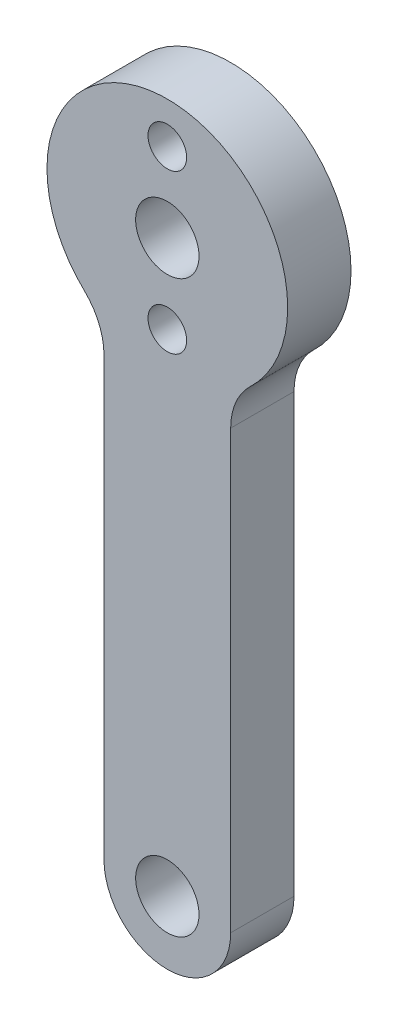
ISO-10303-21;
HEADER;
FILE_DESCRIPTION(('STEP AP214'),'2;1');
FILE_NAME('part.step','',(''),(''),'','','');
FILE_SCHEMA(('AUTOMOTIVE_DESIGN { 1 0 10303 214 1 1 1 1 }'));
ENDSEC;
DATA;
#1=APPLICATION_CONTEXT('core data for automotive mechanical design processes');
#2=APPLICATION_PROTOCOL_DEFINITION('international standard','automotive_design',2000,#1);
#3=PRODUCT_CONTEXT('',#1,'mechanical');
#4=PRODUCT('Part','Part','',(#3));
#5=PRODUCT_RELATED_PRODUCT_CATEGORY('part','',(#4));
#6=PRODUCT_DEFINITION_FORMATION('','',#4);
#7=PRODUCT_DEFINITION_CONTEXT('part definition',#1,'design');
#8=PRODUCT_DEFINITION('design','',#6,#7);
#9=PRODUCT_DEFINITION_SHAPE('','',#8);
#10=(LENGTH_UNIT() NAMED_UNIT(*) SI_UNIT(.MILLI.,.METRE.));
#11=(NAMED_UNIT(*) PLANE_ANGLE_UNIT() SI_UNIT($,.RADIAN.));
#12=(NAMED_UNIT(*) SI_UNIT($,.STERADIAN.) SOLID_ANGLE_UNIT());
#13=UNCERTAINTY_MEASURE_WITH_UNIT(LENGTH_MEASURE(1.E-05),#10,'distance_accuracy_value','');
#14=(GEOMETRIC_REPRESENTATION_CONTEXT(3) GLOBAL_UNCERTAINTY_ASSIGNED_CONTEXT((#13)) GLOBAL_UNIT_ASSIGNED_CONTEXT((#10,
#11,#12)) REPRESENTATION_CONTEXT('',''));
#15=CARTESIAN_POINT('',(0.,0.,0.));
#16=DIRECTION('',(0.,0.,1.));
#17=DIRECTION('',(1.,0.,0.));
#18=AXIS2_PLACEMENT_3D('',#15,#16,#17);
#19=CARTESIAN_POINT('',(0.,-45.,5.));
#20=DIRECTION('',(0.,0.,-1.));
#21=DIRECTION('',(-1.,0.,0.));
#22=AXIS2_PLACEMENT_3D('',#19,#20,#21);
#23=CYLINDRICAL_SURFACE('',#22,5.);
#24=CARTESIAN_POINT('',(0.,-45.,0.));
#25=DIRECTION('',(0.,0.,1.));
#26=DIRECTION('',(1.,0.,0.));
#27=AXIS2_PLACEMENT_3D('',#24,#25,#26);
#28=CIRCLE('',#27,5.);
#29=CARTESIAN_POINT('',(-4.99999999999999,-45.,0.));
#30=VERTEX_POINT('',#29);
#31=CARTESIAN_POINT('',(5.00000000000001,-45.,0.));
#32=VERTEX_POINT('',#31);
#33=EDGE_CURVE('E115',#30,#32,#28,.T.);
#34=ORIENTED_EDGE('',*,*,#33,.T.);
#35=DIRECTION('',(0.,0.,-1.));
#36=VECTOR('',#35,1.);
#37=CARTESIAN_POINT('',(5.00000000000001,-45.,5.));
#38=LINE('',#37,#36);
#39=CARTESIAN_POINT('',(5.00000000000001,-45.,5.));
#40=VERTEX_POINT('',#39);
#41=EDGE_CURVE('E96',#40,#32,#38,.T.);
#42=ORIENTED_EDGE('',*,*,#41,.F.);
#43=CARTESIAN_POINT('',(0.,-45.,5.));
#44=DIRECTION('',(0.,0.,1.));
#45=DIRECTION('',(1.,0.,0.));
#46=AXIS2_PLACEMENT_3D('',#43,#44,#45);
#47=CIRCLE('',#46,5.);
#48=CARTESIAN_POINT('',(-4.99999999999999,-45.,5.));
#49=VERTEX_POINT('',#48);
#50=EDGE_CURVE('E103',#49,#40,#47,.T.);
#51=ORIENTED_EDGE('',*,*,#50,.F.);
#52=DIRECTION('',(0.,0.,-1.));
#53=VECTOR('',#52,1.);
#54=CARTESIAN_POINT('',(-4.99999999999999,-45.,5.));
#55=LINE('',#54,#53);
#56=EDGE_CURVE('E118',#49,#30,#55,.T.);
#57=ORIENTED_EDGE('',*,*,#56,.T.);
#58=EDGE_LOOP('',(#34,#42,#51,#57));
#59=FACE_BOUND('',#58,.T.);
#60=ADVANCED_FACE('F38',(#59),#23,.T.);
#61=CARTESIAN_POINT('',(5.,-8.07774721070176,5.));
#62=DIRECTION('',(-1.,0.,0.));
#63=DIRECTION('',(0.,-1.,0.));
#64=AXIS2_PLACEMENT_3D('',#61,#62,#63);
#65=PLANE('',#64);
#66=DIRECTION('',(0.,1.,0.));
#67=VECTOR('',#66,1.);
#68=CARTESIAN_POINT('',(5.,-8.07774721070176,0.));
#69=LINE('',#68,#67);
#70=CARTESIAN_POINT('',(5.,-10.5,0.));
#71=VERTEX_POINT('',#70);
#72=EDGE_CURVE('E157',#32,#71,#69,.T.);
#73=ORIENTED_EDGE('',*,*,#72,.T.);
#74=DIRECTION('',(0.,0.,1.));
#75=VECTOR('',#74,1.);
#76=CARTESIAN_POINT('',(5.,-10.5,5.));
#77=LINE('',#76,#75);
#78=CARTESIAN_POINT('',(5.,-10.5,5.));
#79=VERTEX_POINT('',#78);
#80=EDGE_CURVE('E99',#71,#79,#77,.T.);
#81=ORIENTED_EDGE('',*,*,#80,.T.);
#82=DIRECTION('',(0.,1.,0.));
#83=VECTOR('',#82,1.);
#84=CARTESIAN_POINT('',(5.,-8.07774721070176,5.));
#85=LINE('',#84,#83);
#86=EDGE_CURVE('E91',#40,#79,#85,.T.);
#87=ORIENTED_EDGE('',*,*,#86,.F.);
#88=ORIENTED_EDGE('',*,*,#41,.T.);
#89=EDGE_LOOP('',(#73,#81,#87,#88));
#90=FACE_BOUND('',#89,.T.);
#91=ADVANCED_FACE('F94',(#90),#65,.F.);
#92=CARTESIAN_POINT('',(0.,0.,5.));
#93=DIRECTION('',(0.,0.,-1.));
#94=DIRECTION('',(-1.,0.,0.));
#95=AXIS2_PLACEMENT_3D('',#92,#93,#94);
#96=CYLINDRICAL_SURFACE('',#95,9.5);
#97=CARTESIAN_POINT('',(0.,0.,5.));
#98=DIRECTION('',(0.,0.,1.));
#99=DIRECTION('',(1.,0.,0.));
#100=AXIS2_PLACEMENT_3D('',#97,#98,#99);
#101=CIRCLE('',#100,9.5);
#102=CARTESIAN_POINT('',(6.55172413793104,-6.87931034482758,5.));
#103=VERTEX_POINT('',#102);
#104=CARTESIAN_POINT('',(-6.55172413793103,-6.87931034482759,5.));
#105=VERTEX_POINT('',#104);
#106=EDGE_CURVE('E102',#103,#105,#101,.T.);
#107=ORIENTED_EDGE('',*,*,#106,.F.);
#108=DIRECTION('',(0.,0.,-1.));
#109=VECTOR('',#108,1.);
#110=CARTESIAN_POINT('',(6.55172413793103,-6.87931034482758,5.));
#111=LINE('',#110,#109);
#112=CARTESIAN_POINT('',(6.55172413793104,-6.87931034482758,0.));
#113=VERTEX_POINT('',#112);
#114=EDGE_CURVE('E122',#103,#113,#111,.T.);
#115=ORIENTED_EDGE('',*,*,#114,.T.);
#116=CARTESIAN_POINT('',(0.,0.,0.));
#117=DIRECTION('',(0.,0.,1.));
#118=DIRECTION('',(1.,0.,0.));
#119=AXIS2_PLACEMENT_3D('',#116,#117,#118);
#120=CIRCLE('',#119,9.5);
#121=CARTESIAN_POINT('',(-6.55172413793103,-6.87931034482759,0.));
#122=VERTEX_POINT('',#121);
#123=EDGE_CURVE('E151',#113,#122,#120,.T.);
#124=ORIENTED_EDGE('',*,*,#123,.T.);
#125=DIRECTION('',(0.,0.,-1.));
#126=VECTOR('',#125,1.);
#127=CARTESIAN_POINT('',(-6.55172413793103,-6.87931034482759,5.));
#128=LINE('',#127,#126);
#129=EDGE_CURVE('E117',#122,#105,#128,.F.);
#130=ORIENTED_EDGE('',*,*,#129,.T.);
#131=EDGE_LOOP('',(#107,#115,#124,#130));
#132=FACE_BOUND('',#131,.T.);
#133=ADVANCED_FACE('F154',(#132),#96,.T.);
#134=CARTESIAN_POINT('',(-5.,-8.07774721070176,5.));
#135=DIRECTION('',(1.,0.,0.));
#136=DIRECTION('',(0.,1.,0.));
#137=AXIS2_PLACEMENT_3D('',#134,#135,#136);
#138=PLANE('',#137);
#139=DIRECTION('',(0.,-1.,0.));
#140=VECTOR('',#139,1.);
#141=CARTESIAN_POINT('',(-5.,-8.07774721070176,5.));
#142=LINE('',#141,#140);
#143=CARTESIAN_POINT('',(-5.,-10.5,5.));
#144=VERTEX_POINT('',#143);
#145=EDGE_CURVE('E107',#144,#49,#142,.T.);
#146=ORIENTED_EDGE('',*,*,#145,.F.);
#147=DIRECTION('',(0.,0.,1.));
#148=VECTOR('',#147,1.);
#149=CARTESIAN_POINT('',(-5.,-10.5,0.));
#150=LINE('',#149,#148);
#151=CARTESIAN_POINT('',(-5.,-10.5,0.));
#152=VERTEX_POINT('',#151);
#153=EDGE_CURVE('E137',#144,#152,#150,.F.);
#154=ORIENTED_EDGE('',*,*,#153,.T.);
#155=DIRECTION('',(0.,-1.,0.));
#156=VECTOR('',#155,1.);
#157=CARTESIAN_POINT('',(-5.,-8.07774721070176,0.));
#158=LINE('',#157,#156);
#159=EDGE_CURVE('E112',#152,#30,#158,.T.);
#160=ORIENTED_EDGE('',*,*,#159,.T.);
#161=ORIENTED_EDGE('',*,*,#56,.F.);
#162=EDGE_LOOP('',(#146,#154,#160,#161));
#163=FACE_BOUND('',#162,.T.);
#164=ADVANCED_FACE('F160',(#163),#138,.F.);
#165=CARTESIAN_POINT('',(0.,-45.,5.));
#166=DIRECTION('',(0.,0.,1.));
#167=DIRECTION('',(1.,0.,0.));
#168=AXIS2_PLACEMENT_3D('',#165,#166,#167);
#169=PLANE('',#168);
#170=CARTESIAN_POINT('',(0.,0.,5.));
#171=DIRECTION('',(0.,0.,1.));
#172=DIRECTION('',(1.,0.,0.));
#173=AXIS2_PLACEMENT_3D('',#170,#171,#172);
#174=CIRCLE('',#173,2.5);
#175=CARTESIAN_POINT('',(2.5,0.,5.));
#176=VERTEX_POINT('',#175);
#177=EDGE_CURVE('E193',#176,#176,#174,.T.);
#178=ORIENTED_EDGE('',*,*,#177,.F.);
#179=EDGE_LOOP('',(#178));
#180=FACE_BOUND('',#179,.T.);
#181=CARTESIAN_POINT('',(0.,6.25,5.));
#182=DIRECTION('',(0.,0.,1.));
#183=DIRECTION('',(1.,0.,0.));
#184=AXIS2_PLACEMENT_3D('',#181,#182,#183);
#185=CIRCLE('',#184,1.525);
#186=CARTESIAN_POINT('',(1.525,6.25,5.));
#187=VERTEX_POINT('',#186);
#188=EDGE_CURVE('E177',#187,#187,#185,.T.);
#189=ORIENTED_EDGE('',*,*,#188,.F.);
#190=EDGE_LOOP('',(#189));
#191=FACE_BOUND('',#190,.T.);
#192=CARTESIAN_POINT('',(0.,-6.25,5.));
#193=DIRECTION('',(0.,0.,1.));
#194=DIRECTION('',(1.,0.,0.));
#195=AXIS2_PLACEMENT_3D('',#192,#193,#194);
#196=CIRCLE('',#195,1.525);
#197=CARTESIAN_POINT('',(1.525,-6.25,5.));
#198=VERTEX_POINT('',#197);
#199=EDGE_CURVE('E185',#198,#198,#196,.T.);
#200=ORIENTED_EDGE('',*,*,#199,.F.);
#201=EDGE_LOOP('',(#200));
#202=FACE_BOUND('',#201,.T.);
#203=CARTESIAN_POINT('',(0.,-45.,5.));
#204=DIRECTION('',(0.,0.,1.));
#205=DIRECTION('',(1.,0.,0.));
#206=AXIS2_PLACEMENT_3D('',#203,#204,#205);
#207=CIRCLE('',#206,2.5);
#208=CARTESIAN_POINT('',(2.50000000000001,-45.,5.));
#209=VERTEX_POINT('',#208);
#210=EDGE_CURVE('E130',#209,#209,#207,.T.);
#211=ORIENTED_EDGE('',*,*,#210,.F.);
#212=EDGE_LOOP('',(#211));
#213=FACE_BOUND('',#212,.T.);
#214=ORIENTED_EDGE('',*,*,#50,.T.);
#215=ORIENTED_EDGE('',*,*,#86,.T.);
#216=CARTESIAN_POINT('',(10.,-10.5,5.));
#217=DIRECTION('',(0.,0.,1.));
#218=DIRECTION('',(1.,0.,0.));
#219=AXIS2_PLACEMENT_3D('',#216,#217,#218);
#220=CIRCLE('',#219,5.);
#221=EDGE_CURVE('E143',#79,#103,#220,.F.);
#222=ORIENTED_EDGE('',*,*,#221,.T.);
#223=ORIENTED_EDGE('',*,*,#106,.T.);
#224=CARTESIAN_POINT('',(-10.,-10.5,5.));
#225=DIRECTION('',(0.,0.,1.));
#226=DIRECTION('',(1.,0.,0.));
#227=AXIS2_PLACEMENT_3D('',#224,#225,#226);
#228=CIRCLE('',#227,5.);
#229=EDGE_CURVE('E11',#105,#144,#228,.F.);
#230=ORIENTED_EDGE('',*,*,#229,.T.);
#231=ORIENTED_EDGE('',*,*,#145,.T.);
#232=EDGE_LOOP('',(#214,#215,#222,#223,#230,#231));
#233=FACE_BOUND('',#232,.T.);
#234=ADVANCED_FACE('F106',(#180,#191,#202,#213,#233),#169,.T.);
#235=CARTESIAN_POINT('',(0.,-45.,0.));
#236=DIRECTION('',(0.,0.,1.));
#237=DIRECTION('',(1.,0.,0.));
#238=AXIS2_PLACEMENT_3D('',#235,#236,#237);
#239=PLANE('',#238);
#240=CARTESIAN_POINT('',(0.,0.,0.));
#241=DIRECTION('',(0.,0.,1.));
#242=DIRECTION('',(1.,0.,0.));
#243=AXIS2_PLACEMENT_3D('',#240,#241,#242);
#244=CIRCLE('',#243,2.5);
#245=CARTESIAN_POINT('',(2.5,0.,0.));
#246=VERTEX_POINT('',#245);
#247=EDGE_CURVE('E189',#246,#246,#244,.T.);
#248=ORIENTED_EDGE('',*,*,#247,.T.);
#249=EDGE_LOOP('',(#248));
#250=FACE_BOUND('',#249,.T.);
#251=CARTESIAN_POINT('',(0.,6.25,0.));
#252=DIRECTION('',(0.,0.,1.));
#253=DIRECTION('',(1.,0.,0.));
#254=AXIS2_PLACEMENT_3D('',#251,#252,#253);
#255=CIRCLE('',#254,1.525);
#256=CARTESIAN_POINT('',(1.525,6.25,0.));
#257=VERTEX_POINT('',#256);
#258=EDGE_CURVE('E173',#257,#257,#255,.T.);
#259=ORIENTED_EDGE('',*,*,#258,.T.);
#260=EDGE_LOOP('',(#259));
#261=FACE_BOUND('',#260,.T.);
#262=CARTESIAN_POINT('',(0.,-6.25,0.));
#263=DIRECTION('',(0.,0.,1.));
#264=DIRECTION('',(1.,0.,0.));
#265=AXIS2_PLACEMENT_3D('',#262,#263,#264);
#266=CIRCLE('',#265,1.525);
#267=CARTESIAN_POINT('',(1.525,-6.25,0.));
#268=VERTEX_POINT('',#267);
#269=EDGE_CURVE('E181',#268,#268,#266,.T.);
#270=ORIENTED_EDGE('',*,*,#269,.T.);
#271=EDGE_LOOP('',(#270));
#272=FACE_BOUND('',#271,.T.);
#273=CARTESIAN_POINT('',(0.,-45.,0.));
#274=DIRECTION('',(0.,0.,1.));
#275=DIRECTION('',(1.,0.,0.));
#276=AXIS2_PLACEMENT_3D('',#273,#274,#275);
#277=CIRCLE('',#276,2.5);
#278=CARTESIAN_POINT('',(2.50000000000001,-45.,0.));
#279=VERTEX_POINT('',#278);
#280=EDGE_CURVE('E127',#279,#279,#277,.T.);
#281=ORIENTED_EDGE('',*,*,#280,.T.);
#282=EDGE_LOOP('',(#281));
#283=FACE_BOUND('',#282,.T.);
#284=ORIENTED_EDGE('',*,*,#33,.F.);
#285=ORIENTED_EDGE('',*,*,#159,.F.);
#286=CARTESIAN_POINT('',(-10.,-10.5,0.));
#287=DIRECTION('',(0.,0.,1.));
#288=DIRECTION('',(1.,0.,0.));
#289=AXIS2_PLACEMENT_3D('',#286,#287,#288);
#290=CIRCLE('',#289,5.);
#291=EDGE_CURVE('E47',#152,#122,#290,.T.);
#292=ORIENTED_EDGE('',*,*,#291,.T.);
#293=ORIENTED_EDGE('',*,*,#123,.F.);
#294=CARTESIAN_POINT('',(10.,-10.5,0.));
#295=DIRECTION('',(0.,0.,1.));
#296=DIRECTION('',(1.,0.,0.));
#297=AXIS2_PLACEMENT_3D('',#294,#295,#296);
#298=CIRCLE('',#297,5.);
#299=EDGE_CURVE('E140',#113,#71,#298,.T.);
#300=ORIENTED_EDGE('',*,*,#299,.T.);
#301=ORIENTED_EDGE('',*,*,#72,.F.);
#302=EDGE_LOOP('',(#284,#285,#292,#293,#300,#301));
#303=FACE_BOUND('',#302,.T.);
#304=ADVANCED_FACE('F150',(#250,#261,#272,#283,#303),#239,.F.);
#305=CARTESIAN_POINT('',(0.,-45.,-19.));
#306=DIRECTION('',(0.,0.,1.));
#307=DIRECTION('',(1.,0.,0.));
#308=AXIS2_PLACEMENT_3D('',#305,#306,#307);
#309=CYLINDRICAL_SURFACE('',#308,2.5);
#310=ORIENTED_EDGE('',*,*,#210,.T.);
#311=EDGE_LOOP('',(#310));
#312=FACE_BOUND('',#311,.T.);
#313=ORIENTED_EDGE('',*,*,#280,.F.);
#314=EDGE_LOOP('',(#313));
#315=FACE_BOUND('',#314,.T.);
#316=ADVANCED_FACE('F210',(#312,#315),#309,.F.);
#317=CARTESIAN_POINT('',(0.,-6.25,0.));
#318=DIRECTION('',(0.,0.,1.));
#319=DIRECTION('',(1.,0.,0.));
#320=AXIS2_PLACEMENT_3D('',#317,#318,#319);
#321=CYLINDRICAL_SURFACE('',#320,1.525);
#322=ORIENTED_EDGE('',*,*,#269,.F.);
#323=EDGE_LOOP('',(#322));
#324=FACE_BOUND('',#323,.T.);
#325=ORIENTED_EDGE('',*,*,#199,.T.);
#326=EDGE_LOOP('',(#325));
#327=FACE_BOUND('',#326,.T.);
#328=ADVANCED_FACE('F213',(#324,#327),#321,.F.);
#329=CARTESIAN_POINT('',(0.,6.25,0.));
#330=DIRECTION('',(0.,0.,1.));
#331=DIRECTION('',(1.,0.,0.));
#332=AXIS2_PLACEMENT_3D('',#329,#330,#331);
#333=CYLINDRICAL_SURFACE('',#332,1.525);
#334=ORIENTED_EDGE('',*,*,#258,.F.);
#335=EDGE_LOOP('',(#334));
#336=FACE_BOUND('',#335,.T.);
#337=ORIENTED_EDGE('',*,*,#188,.T.);
#338=EDGE_LOOP('',(#337));
#339=FACE_BOUND('',#338,.T.);
#340=ADVANCED_FACE('F238',(#336,#339),#333,.F.);
#341=CARTESIAN_POINT('',(0.,0.,0.));
#342=DIRECTION('',(0.,0.,1.));
#343=DIRECTION('',(1.,0.,0.));
#344=AXIS2_PLACEMENT_3D('',#341,#342,#343);
#345=CYLINDRICAL_SURFACE('',#344,2.5);
#346=ORIENTED_EDGE('',*,*,#247,.F.);
#347=EDGE_LOOP('',(#346));
#348=FACE_BOUND('',#347,.T.);
#349=ORIENTED_EDGE('',*,*,#177,.T.);
#350=EDGE_LOOP('',(#349));
#351=FACE_BOUND('',#350,.T.);
#352=ADVANCED_FACE('F199',(#348,#351),#345,.F.);
#353=CARTESIAN_POINT('',(10.,-10.5,5.));
#354=DIRECTION('',(0.,0.,-1.));
#355=DIRECTION('',(-1.,0.,0.));
#356=AXIS2_PLACEMENT_3D('',#353,#354,#355);
#357=CYLINDRICAL_SURFACE('',#356,5.);
#358=ORIENTED_EDGE('',*,*,#221,.F.);
#359=ORIENTED_EDGE('',*,*,#80,.F.);
#360=ORIENTED_EDGE('',*,*,#299,.F.);
#361=ORIENTED_EDGE('',*,*,#114,.F.);
#362=EDGE_LOOP('',(#358,#359,#360,#361));
#363=FACE_BOUND('',#362,.T.);
#364=ADVANCED_FACE('F231',(#363),#357,.F.);
#365=CARTESIAN_POINT('',(-10.,-10.5,5.));
#366=DIRECTION('',(0.,0.,-1.));
#367=DIRECTION('',(-1.,0.,0.));
#368=AXIS2_PLACEMENT_3D('',#365,#366,#367);
#369=CYLINDRICAL_SURFACE('',#368,5.);
#370=ORIENTED_EDGE('',*,*,#229,.F.);
#371=ORIENTED_EDGE('',*,*,#129,.F.);
#372=ORIENTED_EDGE('',*,*,#291,.F.);
#373=ORIENTED_EDGE('',*,*,#153,.F.);
#374=EDGE_LOOP('',(#370,#371,#372,#373));
#375=FACE_BOUND('',#374,.T.);
#376=ADVANCED_FACE('F40',(#375),#369,.F.);
#377=CLOSED_SHELL('',(#60,#91,#133,#164,#234,#304,#316,#328,#340,#352,#364,#376));
#378=MANIFOLD_SOLID_BREP('B2',#377);
#379=ADVANCED_BREP_SHAPE_REPRESENTATION('',(#18,#378),#14);
#380=SHAPE_DEFINITION_REPRESENTATION(#9,#379);
ENDSEC;
END-ISO-10303-21;
